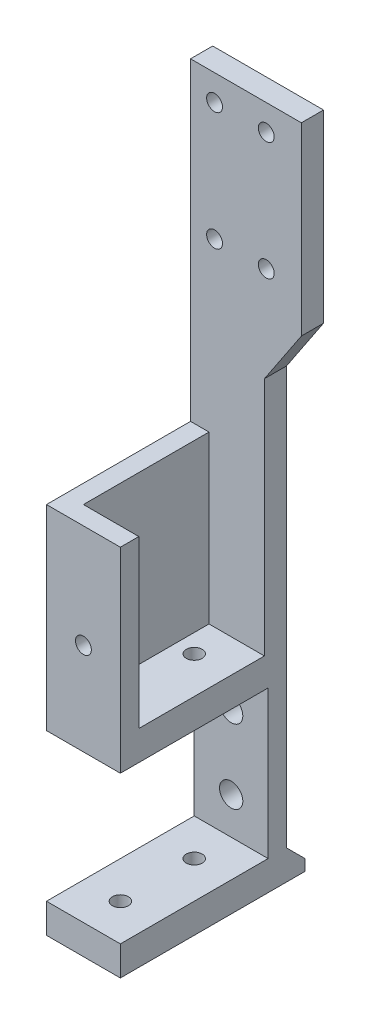
ISO-10303-21;
HEADER;
FILE_DESCRIPTION(('STEP AP214'),'2;1');
FILE_NAME('part.step','',(''),(''),'','','');
FILE_SCHEMA(('AUTOMOTIVE_DESIGN { 1 0 10303 214 1 1 1 1 }'));
ENDSEC;
DATA;
#1=APPLICATION_CONTEXT('core data for automotive mechanical design processes');
#2=APPLICATION_PROTOCOL_DEFINITION('international standard','automotive_design',2000,#1);
#3=PRODUCT_CONTEXT('',#1,'mechanical');
#4=PRODUCT('Part','Part','',(#3));
#5=PRODUCT_RELATED_PRODUCT_CATEGORY('part','',(#4));
#6=PRODUCT_DEFINITION_FORMATION('','',#4);
#7=PRODUCT_DEFINITION_CONTEXT('part definition',#1,'design');
#8=PRODUCT_DEFINITION('design','',#6,#7);
#9=PRODUCT_DEFINITION_SHAPE('','',#8);
#10=(LENGTH_UNIT() NAMED_UNIT(*) SI_UNIT(.MILLI.,.METRE.));
#11=(NAMED_UNIT(*) PLANE_ANGLE_UNIT() SI_UNIT($,.RADIAN.));
#12=(NAMED_UNIT(*) SI_UNIT($,.STERADIAN.) SOLID_ANGLE_UNIT());
#13=UNCERTAINTY_MEASURE_WITH_UNIT(LENGTH_MEASURE(1.E-05),#10,'distance_accuracy_value','');
#14=(GEOMETRIC_REPRESENTATION_CONTEXT(3) GLOBAL_UNCERTAINTY_ASSIGNED_CONTEXT((#13)) GLOBAL_UNIT_ASSIGNED_CONTEXT((#10,
#11,#12)) REPRESENTATION_CONTEXT('',''));
#15=CARTESIAN_POINT('',(0.,0.,0.));
#16=DIRECTION('',(0.,0.,1.));
#17=DIRECTION('',(1.,0.,0.));
#18=AXIS2_PLACEMENT_3D('',#15,#16,#17);
#19=CARTESIAN_POINT('',(70.,78.,0.));
#20=DIRECTION('',(0.,1.,0.));
#21=DIRECTION('',(0.,0.,1.));
#22=AXIS2_PLACEMENT_3D('',#19,#20,#21);
#23=PLANE('',#22);
#24=CARTESIAN_POINT('',(45.,78.,-30.));
#25=DIRECTION('',(0.,-1.,0.));
#26=DIRECTION('',(0.,0.,1.));
#27=AXIS2_PLACEMENT_3D('',#24,#25,#26);
#28=CIRCLE('',#27,2.15);
#29=CARTESIAN_POINT('',(45.,78.,-27.85));
#30=VERTEX_POINT('',#29);
#31=EDGE_CURVE('E283',#30,#30,#28,.T.);
#32=ORIENTED_EDGE('',*,*,#31,.T.);
#33=EDGE_LOOP('',(#32));
#34=FACE_BOUND('',#33,.T.);
#35=CARTESIAN_POINT('',(45.,78.,-10.));
#36=DIRECTION('',(0.,-1.,0.));
#37=DIRECTION('',(0.,0.,1.));
#38=AXIS2_PLACEMENT_3D('',#35,#36,#37);
#39=CIRCLE('',#38,2.15);
#40=CARTESIAN_POINT('',(45.,78.,-7.85));
#41=VERTEX_POINT('',#40);
#42=EDGE_CURVE('E277',#41,#41,#39,.T.);
#43=ORIENTED_EDGE('',*,*,#42,.T.);
#44=EDGE_LOOP('',(#43));
#45=FACE_BOUND('',#44,.T.);
#46=DIRECTION('',(0.,0.,-1.));
#47=VECTOR('',#46,1.);
#48=CARTESIAN_POINT('',(55.,78.,0.));
#49=LINE('',#48,#47);
#50=CARTESIAN_POINT('',(55.,78.,-5.));
#51=VERTEX_POINT('',#50);
#52=CARTESIAN_POINT('',(55.,78.,-39.));
#53=VERTEX_POINT('',#52);
#54=EDGE_CURVE('E183',#51,#53,#49,.T.);
#55=ORIENTED_EDGE('',*,*,#54,.T.);
#56=DIRECTION('',(1.,0.,0.));
#57=VECTOR('',#56,1.);
#58=CARTESIAN_POINT('',(35.,78.,-39.));
#59=LINE('',#58,#57);
#60=CARTESIAN_POINT('',(40.,78.,-39.));
#61=VERTEX_POINT('',#60);
#62=EDGE_CURVE('E226',#61,#53,#59,.T.);
#63=ORIENTED_EDGE('',*,*,#62,.F.);
#64=DIRECTION('',(0.,0.,-1.));
#65=VECTOR('',#64,1.);
#66=CARTESIAN_POINT('',(40.,78.,0.));
#67=LINE('',#66,#65);
#68=CARTESIAN_POINT('',(40.,78.,-5.));
#69=VERTEX_POINT('',#68);
#70=EDGE_CURVE('E189',#69,#61,#67,.T.);
#71=ORIENTED_EDGE('',*,*,#70,.F.);
#72=DIRECTION('',(-1.,0.,0.));
#73=VECTOR('',#72,1.);
#74=CARTESIAN_POINT('',(70.,78.,-5.));
#75=LINE('',#74,#73);
#76=EDGE_CURVE('E179',#51,#69,#75,.T.);
#77=ORIENTED_EDGE('',*,*,#76,.F.);
#78=EDGE_LOOP('',(#55,#63,#71,#77));
#79=FACE_BOUND('',#78,.T.);
#80=ADVANCED_FACE('F40',(#34,#45,#79),#23,.T.);
#81=CARTESIAN_POINT('',(40.,0.,0.));
#82=DIRECTION('',(-1.,0.,0.));
#83=DIRECTION('',(0.,0.,-1.));
#84=AXIS2_PLACEMENT_3D('',#81,#82,#83);
#85=PLANE('',#84);
#86=DIRECTION('',(0.,-1.,0.));
#87=VECTOR('',#86,1.);
#88=CARTESIAN_POINT('',(40.,0.,-5.));
#89=LINE('',#88,#87);
#90=CARTESIAN_POINT('',(40.,123.,-5.));
#91=VERTEX_POINT('',#90);
#92=EDGE_CURVE('E12',#91,#69,#89,.T.);
#93=ORIENTED_EDGE('',*,*,#92,.T.);
#94=ORIENTED_EDGE('',*,*,#70,.T.);
#95=DIRECTION('',(0.,1.,0.));
#96=VECTOR('',#95,1.);
#97=CARTESIAN_POINT('',(40.,78.,-39.));
#98=LINE('',#97,#96);
#99=CARTESIAN_POINT('',(40.,123.,-39.));
#100=VERTEX_POINT('',#99);
#101=EDGE_CURVE('E192',#61,#100,#98,.T.);
#102=ORIENTED_EDGE('',*,*,#101,.T.);
#103=DIRECTION('',(0.,0.,1.));
#104=VECTOR('',#103,1.);
#105=CARTESIAN_POINT('',(40.,123.,-39.));
#106=LINE('',#105,#104);
#107=EDGE_CURVE('E195',#100,#91,#106,.T.);
#108=ORIENTED_EDGE('',*,*,#107,.T.);
#109=EDGE_LOOP('',(#93,#94,#102,#108));
#110=FACE_BOUND('',#109,.T.);
#111=ADVANCED_FACE('F415',(#110),#85,.F.);
#112=CARTESIAN_POINT('',(70.,30.,0.));
#113=DIRECTION('',(0.,-1.,0.));
#114=DIRECTION('',(0.,0.,-1.));
#115=AXIS2_PLACEMENT_3D('',#112,#113,#114);
#116=PLANE('',#115);
#117=CARTESIAN_POINT('',(45.,30.,-10.));
#118=DIRECTION('',(0.,-1.,0.));
#119=DIRECTION('',(0.,0.,1.));
#120=AXIS2_PLACEMENT_3D('',#117,#118,#119);
#121=CIRCLE('',#120,2.15);
#122=CARTESIAN_POINT('',(45.,30.,-7.85));
#123=VERTEX_POINT('',#122);
#124=EDGE_CURVE('E331',#123,#123,#121,.T.);
#125=ORIENTED_EDGE('',*,*,#124,.T.);
#126=EDGE_LOOP('',(#125));
#127=FACE_BOUND('',#126,.T.);
#128=CARTESIAN_POINT('',(45.,30.,-30.));
#129=DIRECTION('',(0.,-1.,0.));
#130=DIRECTION('',(0.,0.,1.));
#131=AXIS2_PLACEMENT_3D('',#128,#129,#130);
#132=CIRCLE('',#131,2.15);
#133=CARTESIAN_POINT('',(45.,30.,-27.85));
#134=VERTEX_POINT('',#133);
#135=EDGE_CURVE('E334',#134,#134,#132,.T.);
#136=ORIENTED_EDGE('',*,*,#135,.T.);
#137=EDGE_LOOP('',(#136));
#138=FACE_BOUND('',#137,.T.);
#139=DIRECTION('',(-1.,0.,0.));
#140=VECTOR('',#139,1.);
#141=CARTESIAN_POINT('',(35.,30.,-40.));
#142=LINE('',#141,#140);
#143=CARTESIAN_POINT('',(55.,30.,-40.));
#144=VERTEX_POINT('',#143);
#145=CARTESIAN_POINT('',(35.,30.,-40.));
#146=VERTEX_POINT('',#145);
#147=EDGE_CURVE('E322',#144,#146,#142,.T.);
#148=ORIENTED_EDGE('',*,*,#147,.T.);
#149=DIRECTION('',(0.,0.,-1.));
#150=VECTOR('',#149,1.);
#151=CARTESIAN_POINT('',(35.,30.,0.));
#152=LINE('',#151,#150);
#153=CARTESIAN_POINT('',(35.,30.,0.));
#154=VERTEX_POINT('',#153);
#155=EDGE_CURVE('E340',#154,#146,#152,.T.);
#156=ORIENTED_EDGE('',*,*,#155,.F.);
#157=DIRECTION('',(-1.,0.,0.));
#158=VECTOR('',#157,1.);
#159=CARTESIAN_POINT('',(70.,30.,0.));
#160=LINE('',#159,#158);
#161=CARTESIAN_POINT('',(55.,30.,0.));
#162=VERTEX_POINT('',#161);
#163=EDGE_CURVE('E337',#162,#154,#160,.T.);
#164=ORIENTED_EDGE('',*,*,#163,.F.);
#165=DIRECTION('',(0.,0.,1.));
#166=VECTOR('',#165,1.);
#167=CARTESIAN_POINT('',(55.,30.,0.));
#168=LINE('',#167,#166);
#169=EDGE_CURVE('E270',#144,#162,#168,.T.);
#170=ORIENTED_EDGE('',*,*,#169,.F.);
#171=EDGE_LOOP('',(#148,#156,#164,#170));
#172=FACE_BOUND('',#171,.T.);
#173=ADVANCED_FACE('F421',(#127,#138,#172),#116,.F.);
#174=CARTESIAN_POINT('',(70.,30.,0.));
#175=DIRECTION('',(0.,0.,-1.));
#176=DIRECTION('',(1.,0.,0.));
#177=AXIS2_PLACEMENT_3D('',#174,#175,#176);
#178=PLANE('',#177);
#179=ORIENTED_EDGE('',*,*,#163,.T.);
#180=DIRECTION('',(0.,-1.,0.));
#181=VECTOR('',#180,1.);
#182=CARTESIAN_POINT('',(35.,30.,0.));
#183=LINE('',#182,#181);
#184=CARTESIAN_POINT('',(35.,22.,0.));
#185=VERTEX_POINT('',#184);
#186=EDGE_CURVE('E343',#154,#185,#183,.T.);
#187=ORIENTED_EDGE('',*,*,#186,.T.);
#188=DIRECTION('',(1.,0.,0.));
#189=VECTOR('',#188,1.);
#190=CARTESIAN_POINT('',(0.,22.,0.));
#191=LINE('',#190,#189);
#192=CARTESIAN_POINT('',(55.,22.,0.));
#193=VERTEX_POINT('',#192);
#194=EDGE_CURVE('E307',#185,#193,#191,.T.);
#195=ORIENTED_EDGE('',*,*,#194,.T.);
#196=DIRECTION('',(0.,1.,0.));
#197=VECTOR('',#196,1.);
#198=CARTESIAN_POINT('',(55.,-40.,0.));
#199=LINE('',#198,#197);
#200=EDGE_CURVE('E298',#193,#162,#199,.T.);
#201=ORIENTED_EDGE('',*,*,#200,.T.);
#202=EDGE_LOOP('',(#179,#187,#195,#201));
#203=FACE_BOUND('',#202,.T.);
#204=ADVANCED_FACE('F452',(#203),#178,.F.);
#205=CARTESIAN_POINT('',(35.,30.,0.));
#206=DIRECTION('',(1.,0.,0.));
#207=DIRECTION('',(0.,0.,1.));
#208=AXIS2_PLACEMENT_3D('',#205,#206,#207);
#209=PLANE('',#208);
#210=DIRECTION('',(0.,0.,-1.));
#211=VECTOR('',#210,1.);
#212=CARTESIAN_POINT('',(35.,70.,0.));
#213=LINE('',#212,#211);
#214=CARTESIAN_POINT('',(35.,70.,0.));
#215=VERTEX_POINT('',#214);
#216=CARTESIAN_POINT('',(35.,70.,-40.));
#217=VERTEX_POINT('',#216);
#218=EDGE_CURVE('E290',#215,#217,#213,.T.);
#219=ORIENTED_EDGE('',*,*,#218,.F.);
#220=DIRECTION('',(0.,-1.,0.));
#221=VECTOR('',#220,1.);
#222=CARTESIAN_POINT('',(35.,78.,0.));
#223=LINE('',#222,#221);
#224=CARTESIAN_POINT('',(35.,123.,0.));
#225=VERTEX_POINT('',#224);
#226=EDGE_CURVE('E293',#225,#215,#223,.T.);
#227=ORIENTED_EDGE('',*,*,#226,.F.);
#228=DIRECTION('',(0.,0.,1.));
#229=VECTOR('',#228,1.);
#230=CARTESIAN_POINT('',(35.,123.,-39.));
#231=LINE('',#230,#229);
#232=CARTESIAN_POINT('',(35.,123.,-39.));
#233=VERTEX_POINT('',#232);
#234=EDGE_CURVE('E188',#233,#225,#231,.T.);
#235=ORIENTED_EDGE('',*,*,#234,.F.);
#236=DIRECTION('',(0.,-1.,0.));
#237=VECTOR('',#236,1.);
#238=CARTESIAN_POINT('',(35.,78.,-39.));
#239=LINE('',#238,#237);
#240=CARTESIAN_POINT('',(35.,208.,-39.));
#241=VERTEX_POINT('',#240);
#242=EDGE_CURVE('E236',#241,#233,#239,.T.);
#243=ORIENTED_EDGE('',*,*,#242,.F.);
#244=DIRECTION('',(0.,0.,-1.));
#245=VECTOR('',#244,1.);
#246=CARTESIAN_POINT('',(35.,208.,-39.));
#247=LINE('',#246,#245);
#248=CARTESIAN_POINT('',(35.,208.,-45.));
#249=VERTEX_POINT('',#248);
#250=EDGE_CURVE('E246',#241,#249,#247,.T.);
#251=ORIENTED_EDGE('',*,*,#250,.T.);
#252=DIRECTION('',(0.,-1.,0.));
#253=VECTOR('',#252,1.);
#254=CARTESIAN_POINT('',(35.,70.,-45.));
#255=LINE('',#254,#253);
#256=CARTESIAN_POINT('',(35.,30.,-45.));
#257=VERTEX_POINT('',#256);
#258=EDGE_CURVE('E328',#249,#257,#255,.T.);
#259=ORIENTED_EDGE('',*,*,#258,.T.);
#260=DIRECTION('',(0.,-0.70710678118655,-0.707106781186546));
#261=VECTOR('',#260,1.);
#262=CARTESIAN_POINT('',(35.,30.,-45.));
#263=LINE('',#262,#261);
#264=CARTESIAN_POINT('',(35.,25.,-50.));
#265=VERTEX_POINT('',#264);
#266=EDGE_CURVE('E48',#265,#257,#263,.F.);
#267=ORIENTED_EDGE('',*,*,#266,.F.);
#268=DIRECTION('',(0.,1.,0.));
#269=VECTOR('',#268,1.);
#270=CARTESIAN_POINT('',(35.,30.,-50.));
#271=LINE('',#270,#269);
#272=CARTESIAN_POINT('',(35.,22.,-50.));
#273=VERTEX_POINT('',#272);
#274=EDGE_CURVE('E346',#273,#265,#271,.T.);
#275=ORIENTED_EDGE('',*,*,#274,.F.);
#276=DIRECTION('',(0.,0.,-1.));
#277=VECTOR('',#276,1.);
#278=CARTESIAN_POINT('',(35.,22.,0.));
#279=LINE('',#278,#277);
#280=EDGE_CURVE('E315',#185,#273,#279,.T.);
#281=ORIENTED_EDGE('',*,*,#280,.F.);
#282=ORIENTED_EDGE('',*,*,#186,.F.);
#283=ORIENTED_EDGE('',*,*,#155,.T.);
#284=DIRECTION('',(0.,-1.,0.));
#285=VECTOR('',#284,1.);
#286=CARTESIAN_POINT('',(35.,70.,-40.));
#287=LINE('',#286,#285);
#288=EDGE_CURVE('E321',#217,#146,#287,.T.);
#289=ORIENTED_EDGE('',*,*,#288,.F.);
#290=EDGE_LOOP('',(#219,#227,#235,#243,#251,#259,#267,#275,#281,#282,#283,#289));
#291=FACE_BOUND('',#290,.T.);
#292=ADVANCED_FACE('F374',(#291),#209,.F.);
#293=CARTESIAN_POINT('',(45.,30.,-30.));
#294=DIRECTION('',(0.,-1.,0.));
#295=DIRECTION('',(0.,0.,-1.));
#296=AXIS2_PLACEMENT_3D('',#293,#294,#295);
#297=CYLINDRICAL_SURFACE('',#296,2.15);
#298=CARTESIAN_POINT('',(45.,22.,-30.));
#299=DIRECTION('',(0.,-1.,0.));
#300=DIRECTION('',(0.,0.,1.));
#301=AXIS2_PLACEMENT_3D('',#298,#299,#300);
#302=CIRCLE('',#301,2.15);
#303=CARTESIAN_POINT('',(45.,22.,-27.85));
#304=VERTEX_POINT('',#303);
#305=EDGE_CURVE('E312',#304,#304,#302,.T.);
#306=ORIENTED_EDGE('',*,*,#305,.T.);
#307=EDGE_LOOP('',(#306));
#308=FACE_BOUND('',#307,.T.);
#309=ORIENTED_EDGE('',*,*,#135,.F.);
#310=EDGE_LOOP('',(#309));
#311=FACE_BOUND('',#310,.T.);
#312=ADVANCED_FACE('F445',(#308,#311),#297,.F.);
#313=CARTESIAN_POINT('',(45.,30.,-10.));
#314=DIRECTION('',(0.,-1.,0.));
#315=DIRECTION('',(0.,0.,-1.));
#316=AXIS2_PLACEMENT_3D('',#313,#314,#315);
#317=CYLINDRICAL_SURFACE('',#316,2.15);
#318=CARTESIAN_POINT('',(45.,22.,-10.));
#319=DIRECTION('',(0.,-1.,0.));
#320=DIRECTION('',(0.,0.,1.));
#321=AXIS2_PLACEMENT_3D('',#318,#319,#320);
#322=CIRCLE('',#321,2.15);
#323=CARTESIAN_POINT('',(45.,22.,-7.85));
#324=VERTEX_POINT('',#323);
#325=EDGE_CURVE('E310',#324,#324,#322,.T.);
#326=ORIENTED_EDGE('',*,*,#325,.T.);
#327=EDGE_LOOP('',(#326));
#328=FACE_BOUND('',#327,.T.);
#329=ORIENTED_EDGE('',*,*,#124,.F.);
#330=EDGE_LOOP('',(#329));
#331=FACE_BOUND('',#330,.T.);
#332=ADVANCED_FACE('F441',(#328,#331),#317,.F.);
#333=CARTESIAN_POINT('',(35.,70.,-45.));
#334=DIRECTION('',(0.,0.,1.));
#335=DIRECTION('',(-1.,0.,0.));
#336=AXIS2_PLACEMENT_3D('',#333,#334,#335);
#337=PLANE('',#336);
#338=CARTESIAN_POINT('',(45.,60.,-45.));
#339=DIRECTION('',(0.,0.,1.));
#340=DIRECTION('',(1.,0.,0.));
#341=AXIS2_PLACEMENT_3D('',#338,#339,#340);
#342=CIRCLE('',#341,3.15);
#343=CARTESIAN_POINT('',(48.15,60.,-45.));
#344=VERTEX_POINT('',#343);
#345=EDGE_CURVE('E301',#344,#344,#342,.T.);
#346=ORIENTED_EDGE('',*,*,#345,.T.);
#347=EDGE_LOOP('',(#346));
#348=FACE_BOUND('',#347,.T.);
#349=CARTESIAN_POINT('',(45.,40.,-45.));
#350=DIRECTION('',(0.,0.,1.));
#351=DIRECTION('',(1.,0.,0.));
#352=AXIS2_PLACEMENT_3D('',#349,#350,#351);
#353=CIRCLE('',#352,3.15);
#354=CARTESIAN_POINT('',(48.15,40.,-45.));
#355=VERTEX_POINT('',#354);
#356=EDGE_CURVE('E300',#355,#355,#353,.T.);
#357=ORIENTED_EDGE('',*,*,#356,.T.);
#358=EDGE_LOOP('',(#357));
#359=FACE_BOUND('',#358,.T.);
#360=DIRECTION('',(0.,1.,0.));
#361=VECTOR('',#360,1.);
#362=CARTESIAN_POINT('',(55.,70.,-45.));
#363=LINE('',#362,#361);
#364=CARTESIAN_POINT('',(55.,30.,-45.));
#365=VERTEX_POINT('',#364);
#366=CARTESIAN_POINT('',(55.,143.,-45.));
#367=VERTEX_POINT('',#366);
#368=EDGE_CURVE('E257',#365,#367,#363,.T.);
#369=ORIENTED_EDGE('',*,*,#368,.F.);
#370=DIRECTION('',(1.,0.,0.));
#371=VECTOR('',#370,1.);
#372=CARTESIAN_POINT('',(35.,30.,-45.));
#373=LINE('',#372,#371);
#374=EDGE_CURVE('E318',#257,#365,#373,.T.);
#375=ORIENTED_EDGE('',*,*,#374,.F.);
#376=ORIENTED_EDGE('',*,*,#258,.F.);
#377=DIRECTION('',(-1.,0.,0.));
#378=VECTOR('',#377,1.);
#379=CARTESIAN_POINT('',(35.,208.,-45.));
#380=LINE('',#379,#378);
#381=CARTESIAN_POINT('',(65.,208.,-45.));
#382=VERTEX_POINT('',#381);
#383=EDGE_CURVE('E228',#382,#249,#380,.T.);
#384=ORIENTED_EDGE('',*,*,#383,.F.);
#385=DIRECTION('',(0.,1.,0.));
#386=VECTOR('',#385,1.);
#387=CARTESIAN_POINT('',(65.,208.,-45.));
#388=LINE('',#387,#386);
#389=CARTESIAN_POINT('',(65.,158.,-45.));
#390=VERTEX_POINT('',#389);
#391=EDGE_CURVE('E242',#390,#382,#388,.T.);
#392=ORIENTED_EDGE('',*,*,#391,.F.);
#393=DIRECTION('',(0.554700196225229,0.832050294337843,0.));
#394=VECTOR('',#393,1.);
#395=CARTESIAN_POINT('',(65.,158.,-45.));
#396=LINE('',#395,#394);
#397=EDGE_CURVE('E223',#367,#390,#396,.T.);
#398=ORIENTED_EDGE('',*,*,#397,.F.);
#399=EDGE_LOOP('',(#369,#375,#376,#384,#392,#398));
#400=FACE_BOUND('',#399,.T.);
#401=CARTESIAN_POINT('',(55.5,169.,-45.));
#402=DIRECTION('',(0.,0.,1.));
#403=DIRECTION('',(1.,0.,0.));
#404=AXIS2_PLACEMENT_3D('',#401,#402,#403);
#405=CIRCLE('',#404,2.15);
#406=CARTESIAN_POINT('',(57.65,169.,-45.));
#407=VERTEX_POINT('',#406);
#408=EDGE_CURVE('E200',#407,#407,#405,.T.);
#409=ORIENTED_EDGE('',*,*,#408,.T.);
#410=EDGE_LOOP('',(#409));
#411=FACE_BOUND('',#410,.T.);
#412=CARTESIAN_POINT('',(41.5,169.,-45.));
#413=DIRECTION('',(0.,0.,1.));
#414=DIRECTION('',(1.,0.,0.));
#415=AXIS2_PLACEMENT_3D('',#412,#413,#414);
#416=CIRCLE('',#415,2.15);
#417=CARTESIAN_POINT('',(43.65,169.,-45.));
#418=VERTEX_POINT('',#417);
#419=EDGE_CURVE('E205',#418,#418,#416,.T.);
#420=ORIENTED_EDGE('',*,*,#419,.T.);
#421=EDGE_LOOP('',(#420));
#422=FACE_BOUND('',#421,.T.);
#423=CARTESIAN_POINT('',(55.5,201.,-45.));
#424=DIRECTION('',(0.,0.,1.));
#425=DIRECTION('',(1.,0.,0.));
#426=AXIS2_PLACEMENT_3D('',#423,#424,#425);
#427=CIRCLE('',#426,2.15);
#428=CARTESIAN_POINT('',(57.65,201.,-45.));
#429=VERTEX_POINT('',#428);
#430=EDGE_CURVE('E211',#429,#429,#427,.T.);
#431=ORIENTED_EDGE('',*,*,#430,.T.);
#432=EDGE_LOOP('',(#431));
#433=FACE_BOUND('',#432,.T.);
#434=CARTESIAN_POINT('',(41.5,201.,-45.));
#435=DIRECTION('',(0.,0.,1.));
#436=DIRECTION('',(1.,0.,0.));
#437=AXIS2_PLACEMENT_3D('',#434,#435,#436);
#438=CIRCLE('',#437,2.15);
#439=CARTESIAN_POINT('',(43.65,201.,-45.));
#440=VERTEX_POINT('',#439);
#441=EDGE_CURVE('E217',#440,#440,#438,.T.);
#442=ORIENTED_EDGE('',*,*,#441,.T.);
#443=EDGE_LOOP('',(#442));
#444=FACE_BOUND('',#443,.T.);
#445=ADVANCED_FACE('F362',(#348,#359,#400,#411,#422,#433,#444),#337,.F.);
#446=CARTESIAN_POINT('',(35.,70.,-40.));
#447=DIRECTION('',(0.,0.,-1.));
#448=DIRECTION('',(1.,0.,0.));
#449=AXIS2_PLACEMENT_3D('',#446,#447,#448);
#450=PLANE('',#449);
#451=CARTESIAN_POINT('',(45.,60.,-40.));
#452=DIRECTION('',(0.,0.,1.));
#453=DIRECTION('',(1.,0.,0.));
#454=AXIS2_PLACEMENT_3D('',#451,#452,#453);
#455=CIRCLE('',#454,3.15);
#456=CARTESIAN_POINT('',(48.15,60.,-40.));
#457=VERTEX_POINT('',#456);
#458=EDGE_CURVE('E311',#457,#457,#455,.T.);
#459=ORIENTED_EDGE('',*,*,#458,.F.);
#460=EDGE_LOOP('',(#459));
#461=FACE_BOUND('',#460,.T.);
#462=CARTESIAN_POINT('',(45.,40.,-40.));
#463=DIRECTION('',(0.,0.,1.));
#464=DIRECTION('',(1.,0.,0.));
#465=AXIS2_PLACEMENT_3D('',#462,#463,#464);
#466=CIRCLE('',#465,3.15);
#467=CARTESIAN_POINT('',(48.15,40.,-40.));
#468=VERTEX_POINT('',#467);
#469=EDGE_CURVE('E304',#468,#468,#466,.T.);
#470=ORIENTED_EDGE('',*,*,#469,.F.);
#471=EDGE_LOOP('',(#470));
#472=FACE_BOUND('',#471,.T.);
#473=DIRECTION('',(-1.,0.,0.));
#474=VECTOR('',#473,1.);
#475=CARTESIAN_POINT('',(35.,70.,-40.));
#476=LINE('',#475,#474);
#477=CARTESIAN_POINT('',(55.,70.,-40.));
#478=VERTEX_POINT('',#477);
#479=EDGE_CURVE('E319',#478,#217,#476,.T.);
#480=ORIENTED_EDGE('',*,*,#479,.T.);
#481=ORIENTED_EDGE('',*,*,#288,.T.);
#482=ORIENTED_EDGE('',*,*,#147,.F.);
#483=DIRECTION('',(0.,-1.,0.));
#484=VECTOR('',#483,1.);
#485=CARTESIAN_POINT('',(55.,70.,-40.));
#486=LINE('',#485,#484);
#487=EDGE_CURVE('E268',#478,#144,#486,.T.);
#488=ORIENTED_EDGE('',*,*,#487,.F.);
#489=EDGE_LOOP('',(#480,#481,#482,#488));
#490=FACE_BOUND('',#489,.T.);
#491=ADVANCED_FACE('F358',(#461,#472,#490),#450,.F.);
#492=CARTESIAN_POINT('',(0.,22.,0.));
#493=DIRECTION('',(0.,1.,0.));
#494=DIRECTION('',(0.,0.,1.));
#495=AXIS2_PLACEMENT_3D('',#492,#493,#494);
#496=PLANE('',#495);
#497=ORIENTED_EDGE('',*,*,#305,.F.);
#498=EDGE_LOOP('',(#497));
#499=FACE_BOUND('',#498,.T.);
#500=ORIENTED_EDGE('',*,*,#325,.F.);
#501=EDGE_LOOP('',(#500));
#502=FACE_BOUND('',#501,.T.);
#503=ORIENTED_EDGE('',*,*,#194,.F.);
#504=ORIENTED_EDGE('',*,*,#280,.T.);
#505=DIRECTION('',(1.,0.,0.));
#506=VECTOR('',#505,1.);
#507=CARTESIAN_POINT('',(0.,22.,-50.));
#508=LINE('',#507,#506);
#509=CARTESIAN_POINT('',(55.,22.,-50.));
#510=VERTEX_POINT('',#509);
#511=EDGE_CURVE('E249',#273,#510,#508,.T.);
#512=ORIENTED_EDGE('',*,*,#511,.T.);
#513=DIRECTION('',(0.,0.,-1.));
#514=VECTOR('',#513,1.);
#515=CARTESIAN_POINT('',(55.,22.,0.));
#516=LINE('',#515,#514);
#517=EDGE_CURVE('E273',#193,#510,#516,.T.);
#518=ORIENTED_EDGE('',*,*,#517,.F.);
#519=EDGE_LOOP('',(#503,#504,#512,#518));
#520=FACE_BOUND('',#519,.T.);
#521=ADVANCED_FACE('F361',(#499,#502,#520),#496,.F.);
#522=CARTESIAN_POINT('',(0.,30.,-50.));
#523=DIRECTION('',(0.,0.,1.));
#524=DIRECTION('',(-1.,0.,0.));
#525=AXIS2_PLACEMENT_3D('',#522,#523,#524);
#526=PLANE('',#525);
#527=ORIENTED_EDGE('',*,*,#274,.T.);
#528=DIRECTION('',(-1.,0.,0.));
#529=VECTOR('',#528,1.);
#530=CARTESIAN_POINT('',(0.,25.,-50.));
#531=LINE('',#530,#529);
#532=CARTESIAN_POINT('',(55.,25.,-50.));
#533=VERTEX_POINT('',#532);
#534=EDGE_CURVE('E63',#533,#265,#531,.T.);
#535=ORIENTED_EDGE('',*,*,#534,.F.);
#536=DIRECTION('',(0.,1.,0.));
#537=VECTOR('',#536,1.);
#538=CARTESIAN_POINT('',(55.,30.,-50.));
#539=LINE('',#538,#537);
#540=EDGE_CURVE('E262',#510,#533,#539,.T.);
#541=ORIENTED_EDGE('',*,*,#540,.F.);
#542=ORIENTED_EDGE('',*,*,#511,.F.);
#543=EDGE_LOOP('',(#527,#535,#541,#542));
#544=FACE_BOUND('',#543,.T.);
#545=ADVANCED_FACE('F405',(#544),#526,.F.);
#546=CARTESIAN_POINT('',(70.,30.,-45.));
#547=DIRECTION('',(0.,-0.707106781186545,0.707106781186549));
#548=DIRECTION('',(1.,0.,0.));
#549=AXIS2_PLACEMENT_3D('',#546,#547,#548);
#550=PLANE('',#549);
#551=DIRECTION('',(0.,0.70710678118655,0.707106781186546));
#552=VECTOR('',#551,1.);
#553=CARTESIAN_POINT('',(55.,30.,-45.));
#554=LINE('',#553,#552);
#555=EDGE_CURVE('E260',#365,#533,#554,.F.);
#556=ORIENTED_EDGE('',*,*,#555,.T.);
#557=ORIENTED_EDGE('',*,*,#534,.T.);
#558=ORIENTED_EDGE('',*,*,#266,.T.);
#559=ORIENTED_EDGE('',*,*,#374,.T.);
#560=EDGE_LOOP('',(#556,#557,#558,#559));
#561=FACE_BOUND('',#560,.T.);
#562=ADVANCED_FACE('F42',(#561),#550,.F.);
#563=CARTESIAN_POINT('',(45.,40.,25.));
#564=DIRECTION('',(0.,0.,-1.));
#565=DIRECTION('',(1.,0.,0.));
#566=AXIS2_PLACEMENT_3D('',#563,#564,#565);
#567=CYLINDRICAL_SURFACE('',#566,3.15);
#568=ORIENTED_EDGE('',*,*,#356,.F.);
#569=EDGE_LOOP('',(#568));
#570=FACE_BOUND('',#569,.T.);
#571=ORIENTED_EDGE('',*,*,#469,.T.);
#572=EDGE_LOOP('',(#571));
#573=FACE_BOUND('',#572,.T.);
#574=ADVANCED_FACE('F404',(#570,#573),#567,.F.);
#575=CARTESIAN_POINT('',(45.,60.,25.));
#576=DIRECTION('',(0.,0.,-1.));
#577=DIRECTION('',(1.,0.,0.));
#578=AXIS2_PLACEMENT_3D('',#575,#576,#577);
#579=CYLINDRICAL_SURFACE('',#578,3.15);
#580=ORIENTED_EDGE('',*,*,#345,.F.);
#581=EDGE_LOOP('',(#580));
#582=FACE_BOUND('',#581,.T.);
#583=ORIENTED_EDGE('',*,*,#458,.T.);
#584=EDGE_LOOP('',(#583));
#585=FACE_BOUND('',#584,.T.);
#586=ADVANCED_FACE('F356',(#582,#585),#579,.F.);
#587=CARTESIAN_POINT('',(70.,70.,0.));
#588=DIRECTION('',(0.,1.,0.));
#589=DIRECTION('',(0.,0.,1.));
#590=AXIS2_PLACEMENT_3D('',#587,#588,#589);
#591=PLANE('',#590);
#592=DIRECTION('',(0.,0.,-1.));
#593=VECTOR('',#592,1.);
#594=CARTESIAN_POINT('',(55.,70.,0.));
#595=LINE('',#594,#593);
#596=CARTESIAN_POINT('',(55.,70.,0.));
#597=VERTEX_POINT('',#596);
#598=EDGE_CURVE('E266',#597,#478,#595,.T.);
#599=ORIENTED_EDGE('',*,*,#598,.F.);
#600=DIRECTION('',(-1.,0.,0.));
#601=VECTOR('',#600,1.);
#602=CARTESIAN_POINT('',(55.,70.,0.));
#603=LINE('',#602,#601);
#604=EDGE_CURVE('E286',#597,#215,#603,.T.);
#605=ORIENTED_EDGE('',*,*,#604,.T.);
#606=ORIENTED_EDGE('',*,*,#218,.T.);
#607=ORIENTED_EDGE('',*,*,#479,.F.);
#608=EDGE_LOOP('',(#599,#605,#606,#607));
#609=FACE_BOUND('',#608,.T.);
#610=CARTESIAN_POINT('',(45.,70.,-10.));
#611=DIRECTION('',(0.,-1.,0.));
#612=DIRECTION('',(0.,0.,1.));
#613=AXIS2_PLACEMENT_3D('',#610,#611,#612);
#614=CIRCLE('',#613,2.15);
#615=CARTESIAN_POINT('',(45.,70.,-7.85));
#616=VERTEX_POINT('',#615);
#617=EDGE_CURVE('E276',#616,#616,#614,.T.);
#618=ORIENTED_EDGE('',*,*,#617,.F.);
#619=EDGE_LOOP('',(#618));
#620=FACE_BOUND('',#619,.T.);
#621=CARTESIAN_POINT('',(45.,70.,-30.));
#622=DIRECTION('',(0.,-1.,0.));
#623=DIRECTION('',(0.,0.,1.));
#624=AXIS2_PLACEMENT_3D('',#621,#622,#623);
#625=CIRCLE('',#624,2.15);
#626=CARTESIAN_POINT('',(45.,70.,-27.85));
#627=VERTEX_POINT('',#626);
#628=EDGE_CURVE('E280',#627,#627,#625,.T.);
#629=ORIENTED_EDGE('',*,*,#628,.F.);
#630=EDGE_LOOP('',(#629));
#631=FACE_BOUND('',#630,.T.);
#632=ADVANCED_FACE('F377',(#609,#620,#631),#591,.F.);
#633=CARTESIAN_POINT('',(55.,78.,0.));
#634=DIRECTION('',(0.,0.,-1.));
#635=DIRECTION('',(1.,0.,0.));
#636=AXIS2_PLACEMENT_3D('',#633,#634,#635);
#637=PLANE('',#636);
#638=ORIENTED_EDGE('',*,*,#604,.F.);
#639=DIRECTION('',(0.,-1.,0.));
#640=VECTOR('',#639,1.);
#641=CARTESIAN_POINT('',(55.,78.,0.));
#642=LINE('',#641,#640);
#643=CARTESIAN_POINT('',(55.,123.,0.));
#644=VERTEX_POINT('',#643);
#645=EDGE_CURVE('E296',#644,#597,#642,.T.);
#646=ORIENTED_EDGE('',*,*,#645,.F.);
#647=DIRECTION('',(-1.,0.,0.));
#648=VECTOR('',#647,1.);
#649=CARTESIAN_POINT('',(40.,123.,0.));
#650=LINE('',#649,#648);
#651=EDGE_CURVE('E177',#644,#225,#650,.T.);
#652=ORIENTED_EDGE('',*,*,#651,.T.);
#653=ORIENTED_EDGE('',*,*,#226,.T.);
#654=EDGE_LOOP('',(#638,#646,#652,#653));
#655=FACE_BOUND('',#654,.T.);
#656=CARTESIAN_POINT('',(45.,95.,0.));
#657=DIRECTION('',(0.,0.,-1.));
#658=DIRECTION('',(-1.,0.,0.));
#659=AXIS2_PLACEMENT_3D('',#656,#657,#658);
#660=CIRCLE('',#659,2.15);
#661=CARTESIAN_POINT('',(42.85,95.,0.));
#662=VERTEX_POINT('',#661);
#663=EDGE_CURVE('E741',#662,#662,#660,.T.);
#664=ORIENTED_EDGE('',*,*,#663,.T.);
#665=EDGE_LOOP('',(#664));
#666=FACE_BOUND('',#665,.T.);
#667=ADVANCED_FACE('F381',(#655,#666),#637,.F.);
#668=CARTESIAN_POINT('',(45.,78.,-30.));
#669=DIRECTION('',(0.,-1.,0.));
#670=DIRECTION('',(0.,0.,-1.));
#671=AXIS2_PLACEMENT_3D('',#668,#669,#670);
#672=CYLINDRICAL_SURFACE('',#671,2.15);
#673=ORIENTED_EDGE('',*,*,#31,.F.);
#674=EDGE_LOOP('',(#673));
#675=FACE_BOUND('',#674,.T.);
#676=ORIENTED_EDGE('',*,*,#628,.T.);
#677=EDGE_LOOP('',(#676));
#678=FACE_BOUND('',#677,.T.);
#679=ADVANCED_FACE('F427',(#675,#678),#672,.F.);
#680=CARTESIAN_POINT('',(45.,78.,-10.));
#681=DIRECTION('',(0.,-1.,0.));
#682=DIRECTION('',(0.,0.,-1.));
#683=AXIS2_PLACEMENT_3D('',#680,#681,#682);
#684=CYLINDRICAL_SURFACE('',#683,2.15);
#685=ORIENTED_EDGE('',*,*,#42,.F.);
#686=EDGE_LOOP('',(#685));
#687=FACE_BOUND('',#686,.T.);
#688=ORIENTED_EDGE('',*,*,#617,.T.);
#689=EDGE_LOOP('',(#688));
#690=FACE_BOUND('',#689,.T.);
#691=ADVANCED_FACE('F481',(#687,#690),#684,.F.);
#692=CARTESIAN_POINT('',(55.,156.,-80.));
#693=DIRECTION('',(-1.,0.,0.));
#694=DIRECTION('',(0.,1.,0.));
#695=AXIS2_PLACEMENT_3D('',#692,#693,#694);
#696=PLANE('',#695);
#697=ORIENTED_EDGE('',*,*,#645,.T.);
#698=ORIENTED_EDGE('',*,*,#598,.T.);
#699=ORIENTED_EDGE('',*,*,#487,.T.);
#700=ORIENTED_EDGE('',*,*,#169,.T.);
#701=ORIENTED_EDGE('',*,*,#200,.F.);
#702=ORIENTED_EDGE('',*,*,#517,.T.);
#703=ORIENTED_EDGE('',*,*,#540,.T.);
#704=ORIENTED_EDGE('',*,*,#555,.F.);
#705=ORIENTED_EDGE('',*,*,#368,.T.);
#706=DIRECTION('',(0.,0.,-1.));
#707=VECTOR('',#706,1.);
#708=CARTESIAN_POINT('',(55.,143.,-39.));
#709=LINE('',#708,#707);
#710=CARTESIAN_POINT('',(55.,143.,-39.));
#711=VERTEX_POINT('',#710);
#712=EDGE_CURVE('E239',#711,#367,#709,.T.);
#713=ORIENTED_EDGE('',*,*,#712,.F.);
#714=DIRECTION('',(0.,1.,0.));
#715=VECTOR('',#714,1.);
#716=CARTESIAN_POINT('',(55.,143.,-39.));
#717=LINE('',#716,#715);
#718=EDGE_CURVE('E55',#53,#711,#717,.T.);
#719=ORIENTED_EDGE('',*,*,#718,.F.);
#720=ORIENTED_EDGE('',*,*,#54,.F.);
#721=DIRECTION('',(0.,-1.,0.));
#722=VECTOR('',#721,1.);
#723=CARTESIAN_POINT('',(55.,70.,-5.));
#724=LINE('',#723,#722);
#725=CARTESIAN_POINT('',(55.,123.,-5.));
#726=VERTEX_POINT('',#725);
#727=EDGE_CURVE('E166',#726,#51,#724,.T.);
#728=ORIENTED_EDGE('',*,*,#727,.F.);
#729=DIRECTION('',(0.,0.,1.));
#730=VECTOR('',#729,1.);
#731=CARTESIAN_POINT('',(55.,123.,-5.));
#732=LINE('',#731,#730);
#733=EDGE_CURVE('E174',#726,#644,#732,.T.);
#734=ORIENTED_EDGE('',*,*,#733,.T.);
#735=EDGE_LOOP('',(#697,#698,#699,#700,#701,#702,#703,#704,#705,#713,#719,#720,#728,#734));
#736=FACE_BOUND('',#735,.T.);
#737=ADVANCED_FACE('F181',(#736),#696,.F.);
#738=CARTESIAN_POINT('',(35.,208.,-39.));
#739=DIRECTION('',(0.,1.,0.));
#740=DIRECTION('',(0.,0.,1.));
#741=AXIS2_PLACEMENT_3D('',#738,#739,#740);
#742=PLANE('',#741);
#743=ORIENTED_EDGE('',*,*,#383,.T.);
#744=ORIENTED_EDGE('',*,*,#250,.F.);
#745=DIRECTION('',(-1.,0.,0.));
#746=VECTOR('',#745,1.);
#747=CARTESIAN_POINT('',(35.,208.,-39.));
#748=LINE('',#747,#746);
#749=CARTESIAN_POINT('',(65.,208.,-39.));
#750=VERTEX_POINT('',#749);
#751=EDGE_CURVE('E234',#750,#241,#748,.T.);
#752=ORIENTED_EDGE('',*,*,#751,.F.);
#753=DIRECTION('',(0.,0.,-1.));
#754=VECTOR('',#753,1.);
#755=CARTESIAN_POINT('',(65.,208.,-39.));
#756=LINE('',#755,#754);
#757=EDGE_CURVE('E250',#750,#382,#756,.T.);
#758=ORIENTED_EDGE('',*,*,#757,.T.);
#759=EDGE_LOOP('',(#743,#744,#752,#758));
#760=FACE_BOUND('',#759,.T.);
#761=ADVANCED_FACE('F393',(#760),#742,.T.);
#762=CARTESIAN_POINT('',(65.,208.,-39.));
#763=DIRECTION('',(1.,0.,0.));
#764=DIRECTION('',(0.,0.,1.));
#765=AXIS2_PLACEMENT_3D('',#762,#763,#764);
#766=PLANE('',#765);
#767=ORIENTED_EDGE('',*,*,#391,.T.);
#768=ORIENTED_EDGE('',*,*,#757,.F.);
#769=DIRECTION('',(0.,1.,0.));
#770=VECTOR('',#769,1.);
#771=CARTESIAN_POINT('',(65.,208.,-39.));
#772=LINE('',#771,#770);
#773=CARTESIAN_POINT('',(65.,158.,-39.));
#774=VERTEX_POINT('',#773);
#775=EDGE_CURVE('E232',#774,#750,#772,.T.);
#776=ORIENTED_EDGE('',*,*,#775,.F.);
#777=DIRECTION('',(0.,0.,-1.));
#778=VECTOR('',#777,1.);
#779=CARTESIAN_POINT('',(65.,158.,-39.));
#780=LINE('',#779,#778);
#781=EDGE_CURVE('E252',#774,#390,#780,.T.);
#782=ORIENTED_EDGE('',*,*,#781,.T.);
#783=EDGE_LOOP('',(#767,#768,#776,#782));
#784=FACE_BOUND('',#783,.T.);
#785=ADVANCED_FACE('F469',(#784),#766,.T.);
#786=CARTESIAN_POINT('',(65.,158.,-39.));
#787=DIRECTION('',(0.832050294337843,-0.554700196225229,0.));
#788=DIRECTION('',(-0.554700196225229,-0.832050294337843,0.));
#789=AXIS2_PLACEMENT_3D('',#786,#787,#788);
#790=PLANE('',#789);
#791=ORIENTED_EDGE('',*,*,#397,.T.);
#792=ORIENTED_EDGE('',*,*,#781,.F.);
#793=DIRECTION('',(0.554700196225229,0.832050294337843,0.));
#794=VECTOR('',#793,1.);
#795=CARTESIAN_POINT('',(65.,158.,-39.));
#796=LINE('',#795,#794);
#797=EDGE_CURVE('E230',#711,#774,#796,.T.);
#798=ORIENTED_EDGE('',*,*,#797,.F.);
#799=ORIENTED_EDGE('',*,*,#712,.T.);
#800=EDGE_LOOP('',(#791,#792,#798,#799));
#801=FACE_BOUND('',#800,.T.);
#802=ADVANCED_FACE('F466',(#801),#790,.T.);
#803=CARTESIAN_POINT('',(70.,0.,-39.));
#804=DIRECTION('',(0.,0.,1.));
#805=DIRECTION('',(-1.,0.,0.));
#806=AXIS2_PLACEMENT_3D('',#803,#804,#805);
#807=PLANE('',#806);
#808=DIRECTION('',(-1.,0.,0.));
#809=VECTOR('',#808,1.);
#810=CARTESIAN_POINT('',(40.,123.,-39.));
#811=LINE('',#810,#809);
#812=EDGE_CURVE('E197',#100,#233,#811,.T.);
#813=ORIENTED_EDGE('',*,*,#812,.F.);
#814=ORIENTED_EDGE('',*,*,#101,.F.);
#815=ORIENTED_EDGE('',*,*,#62,.T.);
#816=ORIENTED_EDGE('',*,*,#718,.T.);
#817=ORIENTED_EDGE('',*,*,#797,.T.);
#818=ORIENTED_EDGE('',*,*,#775,.T.);
#819=ORIENTED_EDGE('',*,*,#751,.T.);
#820=ORIENTED_EDGE('',*,*,#242,.T.);
#821=EDGE_LOOP('',(#813,#814,#815,#816,#817,#818,#819,#820));
#822=FACE_BOUND('',#821,.T.);
#823=CARTESIAN_POINT('',(55.5,169.,-39.));
#824=DIRECTION('',(0.,0.,1.));
#825=DIRECTION('',(1.,0.,0.));
#826=AXIS2_PLACEMENT_3D('',#823,#824,#825);
#827=CIRCLE('',#826,2.15);
#828=CARTESIAN_POINT('',(57.65,169.,-39.));
#829=VERTEX_POINT('',#828);
#830=EDGE_CURVE('E202',#829,#829,#827,.T.);
#831=ORIENTED_EDGE('',*,*,#830,.F.);
#832=EDGE_LOOP('',(#831));
#833=FACE_BOUND('',#832,.T.);
#834=CARTESIAN_POINT('',(41.5,169.,-39.));
#835=DIRECTION('',(0.,0.,1.));
#836=DIRECTION('',(1.,0.,0.));
#837=AXIS2_PLACEMENT_3D('',#834,#835,#836);
#838=CIRCLE('',#837,2.15);
#839=CARTESIAN_POINT('',(43.65,169.,-39.));
#840=VERTEX_POINT('',#839);
#841=EDGE_CURVE('E208',#840,#840,#838,.T.);
#842=ORIENTED_EDGE('',*,*,#841,.F.);
#843=EDGE_LOOP('',(#842));
#844=FACE_BOUND('',#843,.T.);
#845=CARTESIAN_POINT('',(55.5,201.,-39.));
#846=DIRECTION('',(0.,0.,1.));
#847=DIRECTION('',(1.,0.,0.));
#848=AXIS2_PLACEMENT_3D('',#845,#846,#847);
#849=CIRCLE('',#848,2.15);
#850=CARTESIAN_POINT('',(57.65,201.,-39.));
#851=VERTEX_POINT('',#850);
#852=EDGE_CURVE('E214',#851,#851,#849,.T.);
#853=ORIENTED_EDGE('',*,*,#852,.F.);
#854=EDGE_LOOP('',(#853));
#855=FACE_BOUND('',#854,.T.);
#856=CARTESIAN_POINT('',(41.5,201.,-39.));
#857=DIRECTION('',(0.,0.,1.));
#858=DIRECTION('',(1.,0.,0.));
#859=AXIS2_PLACEMENT_3D('',#856,#857,#858);
#860=CIRCLE('',#859,2.15);
#861=CARTESIAN_POINT('',(43.65,201.,-39.));
#862=VERTEX_POINT('',#861);
#863=EDGE_CURVE('E220',#862,#862,#860,.T.);
#864=ORIENTED_EDGE('',*,*,#863,.F.);
#865=EDGE_LOOP('',(#864));
#866=FACE_BOUND('',#865,.T.);
#867=ADVANCED_FACE('F386',(#822,#833,#844,#855,#866),#807,.T.);
#868=CARTESIAN_POINT('',(41.5,201.,-39.));
#869=DIRECTION('',(0.,0.,-1.));
#870=DIRECTION('',(1.,0.,0.));
#871=AXIS2_PLACEMENT_3D('',#868,#869,#870);
#872=CYLINDRICAL_SURFACE('',#871,2.15);
#873=ORIENTED_EDGE('',*,*,#863,.T.);
#874=EDGE_LOOP('',(#873));
#875=FACE_BOUND('',#874,.T.);
#876=ORIENTED_EDGE('',*,*,#441,.F.);
#877=EDGE_LOOP('',(#876));
#878=FACE_BOUND('',#877,.T.);
#879=ADVANCED_FACE('F665',(#875,#878),#872,.F.);
#880=CARTESIAN_POINT('',(55.5,201.,-39.));
#881=DIRECTION('',(0.,0.,-1.));
#882=DIRECTION('',(1.,0.,0.));
#883=AXIS2_PLACEMENT_3D('',#880,#881,#882);
#884=CYLINDRICAL_SURFACE('',#883,2.15);
#885=ORIENTED_EDGE('',*,*,#852,.T.);
#886=EDGE_LOOP('',(#885));
#887=FACE_BOUND('',#886,.T.);
#888=ORIENTED_EDGE('',*,*,#430,.F.);
#889=EDGE_LOOP('',(#888));
#890=FACE_BOUND('',#889,.T.);
#891=ADVANCED_FACE('F672',(#887,#890),#884,.F.);
#892=CARTESIAN_POINT('',(41.5,169.,-39.));
#893=DIRECTION('',(0.,0.,-1.));
#894=DIRECTION('',(1.,0.,0.));
#895=AXIS2_PLACEMENT_3D('',#892,#893,#894);
#896=CYLINDRICAL_SURFACE('',#895,2.15);
#897=ORIENTED_EDGE('',*,*,#841,.T.);
#898=EDGE_LOOP('',(#897));
#899=FACE_BOUND('',#898,.T.);
#900=ORIENTED_EDGE('',*,*,#419,.F.);
#901=EDGE_LOOP('',(#900));
#902=FACE_BOUND('',#901,.T.);
#903=ADVANCED_FACE('F681',(#899,#902),#896,.F.);
#904=CARTESIAN_POINT('',(55.5,169.,-39.));
#905=DIRECTION('',(0.,0.,-1.));
#906=DIRECTION('',(1.,0.,0.));
#907=AXIS2_PLACEMENT_3D('',#904,#905,#906);
#908=CYLINDRICAL_SURFACE('',#907,2.15);
#909=ORIENTED_EDGE('',*,*,#830,.T.);
#910=EDGE_LOOP('',(#909));
#911=FACE_BOUND('',#910,.T.);
#912=ORIENTED_EDGE('',*,*,#408,.F.);
#913=EDGE_LOOP('',(#912));
#914=FACE_BOUND('',#913,.T.);
#915=ADVANCED_FACE('F690',(#911,#914),#908,.F.);
#916=CARTESIAN_POINT('',(40.,123.,-39.));
#917=DIRECTION('',(0.,1.,0.));
#918=DIRECTION('',(0.,0.,1.));
#919=AXIS2_PLACEMENT_3D('',#916,#917,#918);
#920=PLANE('',#919);
#921=ORIENTED_EDGE('',*,*,#651,.F.);
#922=ORIENTED_EDGE('',*,*,#733,.F.);
#923=DIRECTION('',(1.,0.,0.));
#924=VECTOR('',#923,1.);
#925=CARTESIAN_POINT('',(35.,123.,-5.));
#926=LINE('',#925,#924);
#927=EDGE_CURVE('E160',#91,#726,#926,.T.);
#928=ORIENTED_EDGE('',*,*,#927,.F.);
#929=ORIENTED_EDGE('',*,*,#107,.F.);
#930=ORIENTED_EDGE('',*,*,#812,.T.);
#931=ORIENTED_EDGE('',*,*,#234,.T.);
#932=EDGE_LOOP('',(#921,#922,#928,#929,#930,#931));
#933=FACE_BOUND('',#932,.T.);
#934=ADVANCED_FACE('F175',(#933),#920,.T.);
#935=CARTESIAN_POINT('',(70.,0.,-5.));
#936=DIRECTION('',(0.,0.,1.));
#937=DIRECTION('',(-1.,0.,0.));
#938=AXIS2_PLACEMENT_3D('',#935,#936,#937);
#939=PLANE('',#938);
#940=ORIENTED_EDGE('',*,*,#76,.T.);
#941=ORIENTED_EDGE('',*,*,#92,.F.);
#942=ORIENTED_EDGE('',*,*,#927,.T.);
#943=ORIENTED_EDGE('',*,*,#727,.T.);
#944=EDGE_LOOP('',(#940,#941,#942,#943));
#945=FACE_BOUND('',#944,.T.);
#946=CARTESIAN_POINT('',(45.,95.,-5.));
#947=DIRECTION('',(0.,0.,-1.));
#948=DIRECTION('',(-1.,0.,0.));
#949=AXIS2_PLACEMENT_3D('',#946,#947,#948);
#950=CIRCLE('',#949,2.15);
#951=CARTESIAN_POINT('',(42.85,95.,-5.));
#952=VERTEX_POINT('',#951);
#953=EDGE_CURVE('E171',#952,#952,#950,.T.);
#954=ORIENTED_EDGE('',*,*,#953,.F.);
#955=EDGE_LOOP('',(#954));
#956=FACE_BOUND('',#955,.T.);
#957=ADVANCED_FACE('F163',(#945,#956),#939,.F.);
#958=CARTESIAN_POINT('',(45.,95.,-5.));
#959=DIRECTION('',(0.,0.,1.));
#960=DIRECTION('',(-1.,0.,0.));
#961=AXIS2_PLACEMENT_3D('',#958,#959,#960);
#962=CYLINDRICAL_SURFACE('',#961,2.15);
#963=ORIENTED_EDGE('',*,*,#953,.T.);
#964=EDGE_LOOP('',(#963));
#965=FACE_BOUND('',#964,.T.);
#966=ORIENTED_EDGE('',*,*,#663,.F.);
#967=EDGE_LOOP('',(#966));
#968=FACE_BOUND('',#967,.T.);
#969=ADVANCED_FACE('F717',(#965,#968),#962,.F.);
#970=CLOSED_SHELL('',(#80,#111,#173,#204,#292,#312,#332,#445,#491,#521,#545,#562,#574,#586,#632,
#667,#679,#691,#737,#761,#785,#802,#867,#879,#891,#903,#915,#934,#957,#969));
#971=MANIFOLD_SOLID_BREP('B2',#970);
#972=ADVANCED_BREP_SHAPE_REPRESENTATION('',(#18,#971),#14);
#973=SHAPE_DEFINITION_REPRESENTATION(#9,#972);
ENDSEC;
END-ISO-10303-21;
